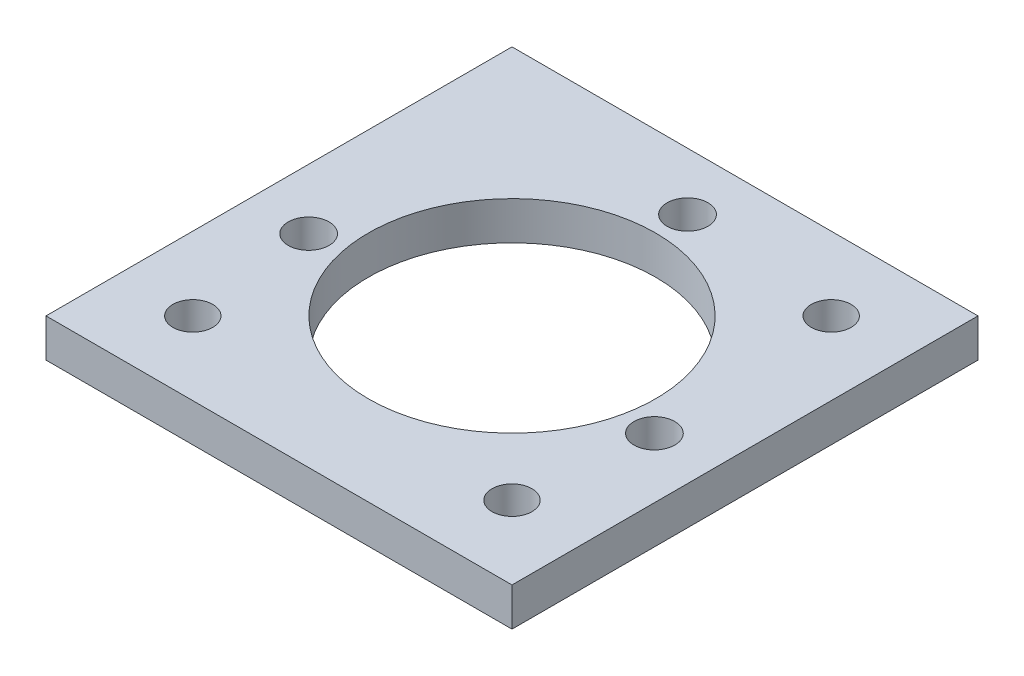
ISO-10303-21;
HEADER;
FILE_DESCRIPTION(('STEP AP214'),'2;1');
FILE_NAME('part.step','',(''),(''),'','','');
FILE_SCHEMA(('AUTOMOTIVE_DESIGN { 1 0 10303 214 1 1 1 1 }'));
ENDSEC;
DATA;
#1=APPLICATION_CONTEXT('core data for automotive mechanical design processes');
#2=APPLICATION_PROTOCOL_DEFINITION('international standard','automotive_design',2000,#1);
#3=PRODUCT_CONTEXT('',#1,'mechanical');
#4=PRODUCT('Part','Part','',(#3));
#5=PRODUCT_RELATED_PRODUCT_CATEGORY('part','',(#4));
#6=PRODUCT_DEFINITION_FORMATION('','',#4);
#7=PRODUCT_DEFINITION_CONTEXT('part definition',#1,'design');
#8=PRODUCT_DEFINITION('design','',#6,#7);
#9=PRODUCT_DEFINITION_SHAPE('','',#8);
#10=(LENGTH_UNIT() NAMED_UNIT(*) SI_UNIT(.MILLI.,.METRE.));
#11=(NAMED_UNIT(*) PLANE_ANGLE_UNIT() SI_UNIT($,.RADIAN.));
#12=(NAMED_UNIT(*) SI_UNIT($,.STERADIAN.) SOLID_ANGLE_UNIT());
#13=UNCERTAINTY_MEASURE_WITH_UNIT(LENGTH_MEASURE(1.E-05),#10,'distance_accuracy_value','');
#14=(GEOMETRIC_REPRESENTATION_CONTEXT(3) GLOBAL_UNCERTAINTY_ASSIGNED_CONTEXT((#13)) GLOBAL_UNIT_ASSIGNED_CONTEXT((#10,
#11,#12)) REPRESENTATION_CONTEXT('',''));
#15=CARTESIAN_POINT('',(0.,0.,0.));
#16=DIRECTION('',(0.,0.,1.));
#17=DIRECTION('',(1.,0.,0.));
#18=AXIS2_PLACEMENT_3D('',#15,#16,#17);
#19=CARTESIAN_POINT('',(0.,6.,0.));
#20=DIRECTION('',(0.,-1.,0.));
#21=DIRECTION('',(0.,0.,-1.));
#22=AXIS2_PLACEMENT_3D('',#19,#20,#21);
#23=PLANE('',#22);
#24=CARTESIAN_POINT('',(11.5,6.,-11.5));
#25=DIRECTION('',(0.,-1.,0.));
#26=DIRECTION('',(0.,0.,-1.));
#27=AXIS2_PLACEMENT_3D('',#24,#25,#26);
#28=CIRCLE('',#27,3.125);
#29=CARTESIAN_POINT('',(11.5,6.,-14.625));
#30=VERTEX_POINT('',#29);
#31=EDGE_CURVE('E148',#30,#30,#28,.T.);
#32=ORIENTED_EDGE('',*,*,#31,.T.);
#33=EDGE_LOOP('',(#32));
#34=FACE_BOUND('',#33,.T.);
#35=CARTESIAN_POINT('',(61.5,6.,-11.5));
#36=DIRECTION('',(0.,-1.,0.));
#37=DIRECTION('',(0.,0.,-1.));
#38=AXIS2_PLACEMENT_3D('',#35,#36,#37);
#39=CIRCLE('',#38,3.125);
#40=CARTESIAN_POINT('',(61.5,6.,-14.625));
#41=VERTEX_POINT('',#40);
#42=EDGE_CURVE('E142',#41,#41,#39,.T.);
#43=ORIENTED_EDGE('',*,*,#42,.T.);
#44=EDGE_LOOP('',(#43));
#45=FACE_BOUND('',#44,.T.);
#46=CARTESIAN_POINT('',(61.5,6.,-61.5));
#47=DIRECTION('',(0.,-1.,0.));
#48=DIRECTION('',(0.,0.,-1.));
#49=AXIS2_PLACEMENT_3D('',#46,#47,#48);
#50=CIRCLE('',#49,3.125);
#51=CARTESIAN_POINT('',(61.5,6.,-64.625));
#52=VERTEX_POINT('',#51);
#53=EDGE_CURVE('E134',#52,#52,#50,.T.);
#54=ORIENTED_EDGE('',*,*,#53,.T.);
#55=EDGE_LOOP('',(#54));
#56=FACE_BOUND('',#55,.T.);
#57=DIRECTION('',(0.,0.,1.));
#58=VECTOR('',#57,1.);
#59=CARTESIAN_POINT('',(0.,6.,0.));
#60=LINE('',#59,#58);
#61=CARTESIAN_POINT('',(0.,6.,-73.));
#62=VERTEX_POINT('',#61);
#63=CARTESIAN_POINT('',(0.,6.,0.));
#64=VERTEX_POINT('',#63);
#65=EDGE_CURVE('E86',#62,#64,#60,.T.);
#66=ORIENTED_EDGE('',*,*,#65,.T.);
#67=DIRECTION('',(1.,0.,0.));
#68=VECTOR('',#67,1.);
#69=CARTESIAN_POINT('',(0.,6.,0.));
#70=LINE('',#69,#68);
#71=CARTESIAN_POINT('',(73.,6.,0.));
#72=VERTEX_POINT('',#71);
#73=EDGE_CURVE('E81',#64,#72,#70,.T.);
#74=ORIENTED_EDGE('',*,*,#73,.T.);
#75=DIRECTION('',(0.,0.,-1.));
#76=VECTOR('',#75,1.);
#77=CARTESIAN_POINT('',(73.,6.,0.));
#78=LINE('',#77,#76);
#79=CARTESIAN_POINT('',(73.,6.,-73.));
#80=VERTEX_POINT('',#79);
#81=EDGE_CURVE('E84',#72,#80,#78,.T.);
#82=ORIENTED_EDGE('',*,*,#81,.T.);
#83=DIRECTION('',(-1.,0.,0.));
#84=VECTOR('',#83,1.);
#85=CARTESIAN_POINT('',(0.,6.,-73.));
#86=LINE('',#85,#84);
#87=EDGE_CURVE('E51',#80,#62,#86,.T.);
#88=ORIENTED_EDGE('',*,*,#87,.T.);
#89=EDGE_LOOP('',(#66,#74,#82,#88));
#90=FACE_BOUND('',#89,.T.);
#91=CARTESIAN_POINT('',(36.5,6.,-64.));
#92=DIRECTION('',(0.,1.,0.));
#93=DIRECTION('',(0.,0.,1.));
#94=AXIS2_PLACEMENT_3D('',#91,#92,#93);
#95=CIRCLE('',#94,3.19999999999999);
#96=CARTESIAN_POINT('',(36.5,6.,-60.8));
#97=VERTEX_POINT('',#96);
#98=EDGE_CURVE('E101',#97,#97,#95,.T.);
#99=ORIENTED_EDGE('',*,*,#98,.F.);
#100=EDGE_LOOP('',(#99));
#101=FACE_BOUND('',#100,.T.);
#102=CARTESIAN_POINT('',(63.5822132078357,6.,-31.7246751141595));
#103=DIRECTION('',(0.,1.,0.));
#104=DIRECTION('',(0.,0.,1.));
#105=AXIS2_PLACEMENT_3D('',#102,#103,#104);
#106=CIRCLE('',#105,3.2);
#107=CARTESIAN_POINT('',(63.5822132078357,6.,-28.5246751141595));
#108=VERTEX_POINT('',#107);
#109=EDGE_CURVE('E116',#108,#108,#106,.T.);
#110=ORIENTED_EDGE('',*,*,#109,.F.);
#111=EDGE_LOOP('',(#110));
#112=FACE_BOUND('',#111,.T.);
#113=CARTESIAN_POINT('',(9.41778679216427,6.,-31.7246751141595));
#114=DIRECTION('',(0.,1.,0.));
#115=DIRECTION('',(0.,0.,1.));
#116=AXIS2_PLACEMENT_3D('',#113,#114,#115);
#117=CIRCLE('',#116,3.2);
#118=CARTESIAN_POINT('',(9.41778679216427,6.,-28.5246751141595));
#119=VERTEX_POINT('',#118);
#120=EDGE_CURVE('E122',#119,#119,#117,.T.);
#121=ORIENTED_EDGE('',*,*,#120,.F.);
#122=EDGE_LOOP('',(#121));
#123=FACE_BOUND('',#122,.T.);
#124=CARTESIAN_POINT('',(36.5,6.,-36.5));
#125=DIRECTION('',(0.,1.,0.));
#126=DIRECTION('',(0.,0.,1.));
#127=AXIS2_PLACEMENT_3D('',#124,#125,#126);
#128=CIRCLE('',#127,22.5);
#129=CARTESIAN_POINT('',(36.5,6.,-14.));
#130=VERTEX_POINT('',#129);
#131=EDGE_CURVE('E128',#130,#130,#128,.T.);
#132=ORIENTED_EDGE('',*,*,#131,.F.);
#133=EDGE_LOOP('',(#132));
#134=FACE_BOUND('',#133,.T.);
#135=ADVANCED_FACE('F34',(#34,#45,#56,#90,#101,#112,#123,#134),#23,.F.);
#136=CARTESIAN_POINT('',(0.,0.,0.));
#137=DIRECTION('',(0.,-1.,0.));
#138=DIRECTION('',(0.,0.,-1.));
#139=AXIS2_PLACEMENT_3D('',#136,#137,#138);
#140=PLANE('',#139);
#141=CARTESIAN_POINT('',(11.5,0.,-11.5));
#142=DIRECTION('',(0.,-1.,0.));
#143=DIRECTION('',(0.,0.,-1.));
#144=AXIS2_PLACEMENT_3D('',#141,#142,#143);
#145=CIRCLE('',#144,3.125);
#146=CARTESIAN_POINT('',(11.5,0.,-14.625));
#147=VERTEX_POINT('',#146);
#148=EDGE_CURVE('E151',#147,#147,#145,.T.);
#149=ORIENTED_EDGE('',*,*,#148,.F.);
#150=EDGE_LOOP('',(#149));
#151=FACE_BOUND('',#150,.T.);
#152=CARTESIAN_POINT('',(61.5,0.,-11.5));
#153=DIRECTION('',(0.,-1.,0.));
#154=DIRECTION('',(0.,0.,-1.));
#155=AXIS2_PLACEMENT_3D('',#152,#153,#154);
#156=CIRCLE('',#155,3.125);
#157=CARTESIAN_POINT('',(61.5,0.,-14.625));
#158=VERTEX_POINT('',#157);
#159=EDGE_CURVE('E145',#158,#158,#156,.T.);
#160=ORIENTED_EDGE('',*,*,#159,.F.);
#161=EDGE_LOOP('',(#160));
#162=FACE_BOUND('',#161,.T.);
#163=CARTESIAN_POINT('',(61.5,0.,-61.5));
#164=DIRECTION('',(0.,-1.,0.));
#165=DIRECTION('',(0.,0.,-1.));
#166=AXIS2_PLACEMENT_3D('',#163,#164,#165);
#167=CIRCLE('',#166,3.125);
#168=CARTESIAN_POINT('',(61.5,0.,-64.625));
#169=VERTEX_POINT('',#168);
#170=EDGE_CURVE('E139',#169,#169,#167,.T.);
#171=ORIENTED_EDGE('',*,*,#170,.F.);
#172=EDGE_LOOP('',(#171));
#173=FACE_BOUND('',#172,.T.);
#174=CARTESIAN_POINT('',(9.41778679216427,0.,-31.7246751141595));
#175=DIRECTION('',(0.,1.,0.));
#176=DIRECTION('',(0.,0.,1.));
#177=AXIS2_PLACEMENT_3D('',#174,#175,#176);
#178=CIRCLE('',#177,3.2);
#179=CARTESIAN_POINT('',(9.41778679216427,0.,-28.5246751141595));
#180=VERTEX_POINT('',#179);
#181=EDGE_CURVE('E125',#180,#180,#178,.T.);
#182=ORIENTED_EDGE('',*,*,#181,.T.);
#183=EDGE_LOOP('',(#182));
#184=FACE_BOUND('',#183,.T.);
#185=CARTESIAN_POINT('',(36.5,0.,-64.));
#186=DIRECTION('',(0.,1.,0.));
#187=DIRECTION('',(0.,0.,1.));
#188=AXIS2_PLACEMENT_3D('',#185,#186,#187);
#189=CIRCLE('',#188,3.19999999999999);
#190=CARTESIAN_POINT('',(36.5,0.,-60.8));
#191=VERTEX_POINT('',#190);
#192=EDGE_CURVE('E113',#191,#191,#189,.T.);
#193=ORIENTED_EDGE('',*,*,#192,.T.);
#194=EDGE_LOOP('',(#193));
#195=FACE_BOUND('',#194,.T.);
#196=DIRECTION('',(0.,0.,1.));
#197=VECTOR('',#196,1.);
#198=CARTESIAN_POINT('',(0.,0.,0.));
#199=LINE('',#198,#197);
#200=CARTESIAN_POINT('',(0.,0.,-73.));
#201=VERTEX_POINT('',#200);
#202=CARTESIAN_POINT('',(0.,0.,0.));
#203=VERTEX_POINT('',#202);
#204=EDGE_CURVE('E98',#201,#203,#199,.T.);
#205=ORIENTED_EDGE('',*,*,#204,.F.);
#206=DIRECTION('',(-1.,0.,0.));
#207=VECTOR('',#206,1.);
#208=CARTESIAN_POINT('',(0.,0.,-73.));
#209=LINE('',#208,#207);
#210=CARTESIAN_POINT('',(73.,0.,-73.));
#211=VERTEX_POINT('',#210);
#212=EDGE_CURVE('E74',#211,#201,#209,.T.);
#213=ORIENTED_EDGE('',*,*,#212,.F.);
#214=DIRECTION('',(0.,0.,-1.));
#215=VECTOR('',#214,1.);
#216=CARTESIAN_POINT('',(73.,0.,0.));
#217=LINE('',#216,#215);
#218=CARTESIAN_POINT('',(73.,0.,0.));
#219=VERTEX_POINT('',#218);
#220=EDGE_CURVE('E68',#219,#211,#217,.T.);
#221=ORIENTED_EDGE('',*,*,#220,.F.);
#222=DIRECTION('',(1.,0.,0.));
#223=VECTOR('',#222,1.);
#224=CARTESIAN_POINT('',(0.,0.,0.));
#225=LINE('',#224,#223);
#226=EDGE_CURVE('E90',#203,#219,#225,.T.);
#227=ORIENTED_EDGE('',*,*,#226,.F.);
#228=EDGE_LOOP('',(#205,#213,#221,#227));
#229=FACE_BOUND('',#228,.T.);
#230=CARTESIAN_POINT('',(63.5822132078357,0.,-31.7246751141595));
#231=DIRECTION('',(0.,1.,0.));
#232=DIRECTION('',(0.,0.,1.));
#233=AXIS2_PLACEMENT_3D('',#230,#231,#232);
#234=CIRCLE('',#233,3.2);
#235=CARTESIAN_POINT('',(63.5822132078357,0.,-28.5246751141595));
#236=VERTEX_POINT('',#235);
#237=EDGE_CURVE('E119',#236,#236,#234,.T.);
#238=ORIENTED_EDGE('',*,*,#237,.T.);
#239=EDGE_LOOP('',(#238));
#240=FACE_BOUND('',#239,.T.);
#241=CARTESIAN_POINT('',(36.5,0.,-36.5));
#242=DIRECTION('',(0.,1.,0.));
#243=DIRECTION('',(0.,0.,1.));
#244=AXIS2_PLACEMENT_3D('',#241,#242,#243);
#245=CIRCLE('',#244,22.5);
#246=CARTESIAN_POINT('',(36.5,0.,-14.));
#247=VERTEX_POINT('',#246);
#248=EDGE_CURVE('E131',#247,#247,#245,.T.);
#249=ORIENTED_EDGE('',*,*,#248,.T.);
#250=EDGE_LOOP('',(#249));
#251=FACE_BOUND('',#250,.T.);
#252=ADVANCED_FACE('F109',(#151,#162,#173,#184,#195,#229,#240,#251),#140,.T.);
#253=CARTESIAN_POINT('',(0.,6.,0.));
#254=DIRECTION('',(1.,0.,0.));
#255=DIRECTION('',(0.,0.,-1.));
#256=AXIS2_PLACEMENT_3D('',#253,#254,#255);
#257=PLANE('',#256);
#258=ORIENTED_EDGE('',*,*,#204,.T.);
#259=DIRECTION('',(0.,-1.,0.));
#260=VECTOR('',#259,1.);
#261=CARTESIAN_POINT('',(0.,6.,0.));
#262=LINE('',#261,#260);
#263=EDGE_CURVE('E11',#64,#203,#262,.T.);
#264=ORIENTED_EDGE('',*,*,#263,.F.);
#265=ORIENTED_EDGE('',*,*,#65,.F.);
#266=DIRECTION('',(0.,-1.,0.));
#267=VECTOR('',#266,1.);
#268=CARTESIAN_POINT('',(0.,6.,-73.));
#269=LINE('',#268,#267);
#270=EDGE_CURVE('E94',#62,#201,#269,.T.);
#271=ORIENTED_EDGE('',*,*,#270,.T.);
#272=EDGE_LOOP('',(#258,#264,#265,#271));
#273=FACE_BOUND('',#272,.T.);
#274=ADVANCED_FACE('F36',(#273),#257,.F.);
#275=CARTESIAN_POINT('',(0.,6.,0.));
#276=DIRECTION('',(0.,0.,-1.));
#277=DIRECTION('',(-1.,0.,0.));
#278=AXIS2_PLACEMENT_3D('',#275,#276,#277);
#279=PLANE('',#278);
#280=ORIENTED_EDGE('',*,*,#226,.T.);
#281=DIRECTION('',(0.,-1.,0.));
#282=VECTOR('',#281,1.);
#283=CARTESIAN_POINT('',(73.,6.,0.));
#284=LINE('',#283,#282);
#285=EDGE_CURVE('E43',#72,#219,#284,.T.);
#286=ORIENTED_EDGE('',*,*,#285,.F.);
#287=ORIENTED_EDGE('',*,*,#73,.F.);
#288=ORIENTED_EDGE('',*,*,#263,.T.);
#289=EDGE_LOOP('',(#280,#286,#287,#288));
#290=FACE_BOUND('',#289,.T.);
#291=ADVANCED_FACE('F89',(#290),#279,.F.);
#292=CARTESIAN_POINT('',(73.,6.,0.));
#293=DIRECTION('',(-1.,0.,0.));
#294=DIRECTION('',(0.,0.,1.));
#295=AXIS2_PLACEMENT_3D('',#292,#293,#294);
#296=PLANE('',#295);
#297=ORIENTED_EDGE('',*,*,#220,.T.);
#298=DIRECTION('',(0.,-1.,0.));
#299=VECTOR('',#298,1.);
#300=CARTESIAN_POINT('',(73.,6.,-73.));
#301=LINE('',#300,#299);
#302=EDGE_CURVE('E91',#80,#211,#301,.T.);
#303=ORIENTED_EDGE('',*,*,#302,.F.);
#304=ORIENTED_EDGE('',*,*,#81,.F.);
#305=ORIENTED_EDGE('',*,*,#285,.T.);
#306=EDGE_LOOP('',(#297,#303,#304,#305));
#307=FACE_BOUND('',#306,.T.);
#308=ADVANCED_FACE('F92',(#307),#296,.F.);
#309=CARTESIAN_POINT('',(0.,6.,-73.));
#310=DIRECTION('',(0.,0.,1.));
#311=DIRECTION('',(1.,0.,0.));
#312=AXIS2_PLACEMENT_3D('',#309,#310,#311);
#313=PLANE('',#312);
#314=ORIENTED_EDGE('',*,*,#212,.T.);
#315=ORIENTED_EDGE('',*,*,#270,.F.);
#316=ORIENTED_EDGE('',*,*,#87,.F.);
#317=ORIENTED_EDGE('',*,*,#302,.T.);
#318=EDGE_LOOP('',(#314,#315,#316,#317));
#319=FACE_BOUND('',#318,.T.);
#320=ADVANCED_FACE('F106',(#319),#313,.F.);
#321=CARTESIAN_POINT('',(36.5,6.,-64.));
#322=DIRECTION('',(0.,-1.,0.));
#323=DIRECTION('',(0.,0.,-1.));
#324=AXIS2_PLACEMENT_3D('',#321,#322,#323);
#325=CYLINDRICAL_SURFACE('',#324,3.19999999999999);
#326=ORIENTED_EDGE('',*,*,#98,.T.);
#327=EDGE_LOOP('',(#326));
#328=FACE_BOUND('',#327,.T.);
#329=ORIENTED_EDGE('',*,*,#192,.F.);
#330=EDGE_LOOP('',(#329));
#331=FACE_BOUND('',#330,.T.);
#332=ADVANCED_FACE('F169',(#328,#331),#325,.F.);
#333=CARTESIAN_POINT('',(63.5822132078357,6.,-31.7246751141595));
#334=DIRECTION('',(0.,-1.,0.));
#335=DIRECTION('',(0.,0.,-1.));
#336=AXIS2_PLACEMENT_3D('',#333,#334,#335);
#337=CYLINDRICAL_SURFACE('',#336,3.2);
#338=ORIENTED_EDGE('',*,*,#109,.T.);
#339=EDGE_LOOP('',(#338));
#340=FACE_BOUND('',#339,.T.);
#341=ORIENTED_EDGE('',*,*,#237,.F.);
#342=EDGE_LOOP('',(#341));
#343=FACE_BOUND('',#342,.T.);
#344=ADVANCED_FACE('F171',(#340,#343),#337,.F.);
#345=CARTESIAN_POINT('',(9.41778679216427,6.,-31.7246751141595));
#346=DIRECTION('',(0.,-1.,0.));
#347=DIRECTION('',(0.,0.,-1.));
#348=AXIS2_PLACEMENT_3D('',#345,#346,#347);
#349=CYLINDRICAL_SURFACE('',#348,3.2);
#350=ORIENTED_EDGE('',*,*,#120,.T.);
#351=EDGE_LOOP('',(#350));
#352=FACE_BOUND('',#351,.T.);
#353=ORIENTED_EDGE('',*,*,#181,.F.);
#354=EDGE_LOOP('',(#353));
#355=FACE_BOUND('',#354,.T.);
#356=ADVANCED_FACE('F178',(#352,#355),#349,.F.);
#357=CARTESIAN_POINT('',(36.5,6.,-36.5));
#358=DIRECTION('',(0.,-1.,0.));
#359=DIRECTION('',(0.,0.,-1.));
#360=AXIS2_PLACEMENT_3D('',#357,#358,#359);
#361=CYLINDRICAL_SURFACE('',#360,22.5);
#362=ORIENTED_EDGE('',*,*,#131,.T.);
#363=EDGE_LOOP('',(#362));
#364=FACE_BOUND('',#363,.T.);
#365=ORIENTED_EDGE('',*,*,#248,.F.);
#366=EDGE_LOOP('',(#365));
#367=FACE_BOUND('',#366,.T.);
#368=ADVANCED_FACE('F215',(#364,#367),#361,.F.);
#369=CARTESIAN_POINT('',(61.5,0.,-61.5));
#370=DIRECTION('',(0.,-1.,0.));
#371=DIRECTION('',(0.,0.,-1.));
#372=AXIS2_PLACEMENT_3D('',#369,#370,#371);
#373=CYLINDRICAL_SURFACE('',#372,3.125);
#374=ORIENTED_EDGE('',*,*,#170,.T.);
#375=EDGE_LOOP('',(#374));
#376=FACE_BOUND('',#375,.T.);
#377=ORIENTED_EDGE('',*,*,#53,.F.);
#378=EDGE_LOOP('',(#377));
#379=FACE_BOUND('',#378,.T.);
#380=ADVANCED_FACE('F209',(#376,#379),#373,.F.);
#381=CARTESIAN_POINT('',(61.5,0.,-11.5));
#382=DIRECTION('',(0.,-1.,0.));
#383=DIRECTION('',(0.,0.,-1.));
#384=AXIS2_PLACEMENT_3D('',#381,#382,#383);
#385=CYLINDRICAL_SURFACE('',#384,3.125);
#386=ORIENTED_EDGE('',*,*,#159,.T.);
#387=EDGE_LOOP('',(#386));
#388=FACE_BOUND('',#387,.T.);
#389=ORIENTED_EDGE('',*,*,#42,.F.);
#390=EDGE_LOOP('',(#389));
#391=FACE_BOUND('',#390,.T.);
#392=ADVANCED_FACE('F214',(#388,#391),#385,.F.);
#393=CARTESIAN_POINT('',(11.5,0.,-11.5));
#394=DIRECTION('',(0.,-1.,0.));
#395=DIRECTION('',(0.,0.,-1.));
#396=AXIS2_PLACEMENT_3D('',#393,#394,#395);
#397=CYLINDRICAL_SURFACE('',#396,3.125);
#398=ORIENTED_EDGE('',*,*,#148,.T.);
#399=EDGE_LOOP('',(#398));
#400=FACE_BOUND('',#399,.T.);
#401=ORIENTED_EDGE('',*,*,#31,.F.);
#402=EDGE_LOOP('',(#401));
#403=FACE_BOUND('',#402,.T.);
#404=ADVANCED_FACE('F155',(#400,#403),#397,.F.);
#405=CLOSED_SHELL('',(#135,#252,#274,#291,#308,#320,#332,#344,#356,#368,#380,#392,#404));
#406=MANIFOLD_SOLID_BREP('B2',#405);
#407=ADVANCED_BREP_SHAPE_REPRESENTATION('',(#18,#406),#14);
#408=SHAPE_DEFINITION_REPRESENTATION(#9,#407);
ENDSEC;
END-ISO-10303-21;
